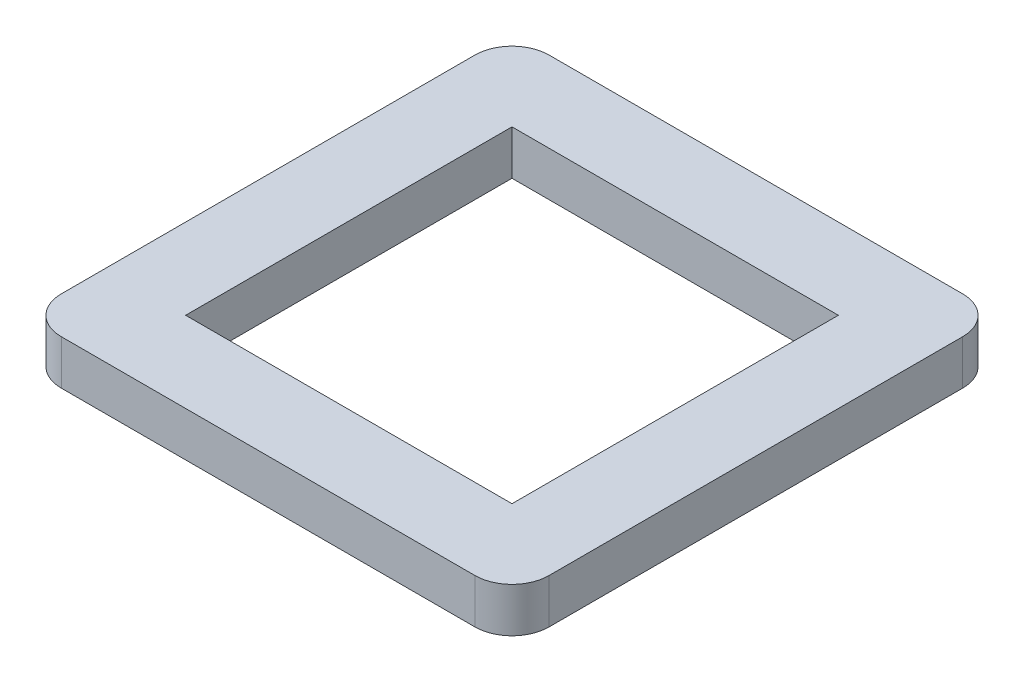
ISO-10303-21;
HEADER;
FILE_DESCRIPTION(('STEP AP214'),'2;1');
FILE_NAME('part.step','',(''),(''),'','','');
FILE_SCHEMA(('AUTOMOTIVE_DESIGN { 1 0 10303 214 1 1 1 1 }'));
ENDSEC;
DATA;
#1=APPLICATION_CONTEXT('core data for automotive mechanical design processes');
#2=APPLICATION_PROTOCOL_DEFINITION('international standard','automotive_design',2000,#1);
#3=PRODUCT_CONTEXT('',#1,'mechanical');
#4=PRODUCT('Part','Part','',(#3));
#5=PRODUCT_RELATED_PRODUCT_CATEGORY('part','',(#4));
#6=PRODUCT_DEFINITION_FORMATION('','',#4);
#7=PRODUCT_DEFINITION_CONTEXT('part definition',#1,'design');
#8=PRODUCT_DEFINITION('design','',#6,#7);
#9=PRODUCT_DEFINITION_SHAPE('','',#8);
#10=(LENGTH_UNIT() NAMED_UNIT(*) SI_UNIT(.MILLI.,.METRE.));
#11=(NAMED_UNIT(*) PLANE_ANGLE_UNIT() SI_UNIT($,.RADIAN.));
#12=(NAMED_UNIT(*) SI_UNIT($,.STERADIAN.) SOLID_ANGLE_UNIT());
#13=UNCERTAINTY_MEASURE_WITH_UNIT(LENGTH_MEASURE(1.E-05),#10,'distance_accuracy_value','');
#14=(GEOMETRIC_REPRESENTATION_CONTEXT(3) GLOBAL_UNCERTAINTY_ASSIGNED_CONTEXT((#13)) GLOBAL_UNIT_ASSIGNED_CONTEXT((#10,
#11,#12)) REPRESENTATION_CONTEXT('',''));
#15=CARTESIAN_POINT('',(0.,0.,0.));
#16=DIRECTION('',(0.,0.,1.));
#17=DIRECTION('',(1.,0.,0.));
#18=AXIS2_PLACEMENT_3D('',#15,#16,#17);
#19=CARTESIAN_POINT('',(69.5,6.35,69.5));
#20=DIRECTION('',(-1.,0.,0.));
#21=DIRECTION('',(0.,0.,1.));
#22=AXIS2_PLACEMENT_3D('',#19,#20,#21);
#23=PLANE('',#22);
#24=DIRECTION('',(0.,0.,-1.));
#25=VECTOR('',#24,1.);
#26=CARTESIAN_POINT('',(69.5,6.35,69.5));
#27=LINE('',#26,#25);
#28=CARTESIAN_POINT('',(69.5,6.35,58.94));
#29=VERTEX_POINT('',#28);
#30=CARTESIAN_POINT('',(69.5,6.35,-58.94));
#31=VERTEX_POINT('',#30);
#32=EDGE_CURVE('E159',#29,#31,#27,.T.);
#33=ORIENTED_EDGE('',*,*,#32,.F.);
#34=DIRECTION('',(0.,-1.,0.));
#35=VECTOR('',#34,1.);
#36=CARTESIAN_POINT('',(69.5,6.35,58.94));
#37=LINE('',#36,#35);
#38=CARTESIAN_POINT('',(69.5,-6.35,58.94));
#39=VERTEX_POINT('',#38);
#40=EDGE_CURVE('E184',#29,#39,#37,.T.);
#41=ORIENTED_EDGE('',*,*,#40,.T.);
#42=DIRECTION('',(0.,0.,-1.));
#43=VECTOR('',#42,1.);
#44=CARTESIAN_POINT('',(69.5,-6.35,69.5));
#45=LINE('',#44,#43);
#46=CARTESIAN_POINT('',(69.5,-6.35,-58.94));
#47=VERTEX_POINT('',#46);
#48=EDGE_CURVE('E155',#39,#47,#45,.T.);
#49=ORIENTED_EDGE('',*,*,#48,.T.);
#50=DIRECTION('',(0.,-1.,0.));
#51=VECTOR('',#50,1.);
#52=CARTESIAN_POINT('',(69.5,6.35,-58.94));
#53=LINE('',#52,#51);
#54=EDGE_CURVE('E172',#47,#31,#53,.F.);
#55=ORIENTED_EDGE('',*,*,#54,.T.);
#56=EDGE_LOOP('',(#33,#41,#49,#55));
#57=FACE_BOUND('',#56,.T.);
#58=ADVANCED_FACE('F33',(#57),#23,.F.);
#59=CARTESIAN_POINT('',(-69.5,6.35,-69.5));
#60=DIRECTION('',(0.,0.,1.));
#61=DIRECTION('',(1.,0.,0.));
#62=AXIS2_PLACEMENT_3D('',#59,#60,#61);
#63=PLANE('',#62);
#64=DIRECTION('',(-1.,0.,0.));
#65=VECTOR('',#64,1.);
#66=CARTESIAN_POINT('',(-69.5,6.35,-69.5));
#67=LINE('',#66,#65);
#68=CARTESIAN_POINT('',(58.9399999999999,6.35,-69.5));
#69=VERTEX_POINT('',#68);
#70=CARTESIAN_POINT('',(-58.94,6.35,-69.5));
#71=VERTEX_POINT('',#70);
#72=EDGE_CURVE('E162',#69,#71,#67,.T.);
#73=ORIENTED_EDGE('',*,*,#72,.F.);
#74=DIRECTION('',(0.,-1.,0.));
#75=VECTOR('',#74,1.);
#76=CARTESIAN_POINT('',(58.9399999999999,6.35,-69.5));
#77=LINE('',#76,#75);
#78=CARTESIAN_POINT('',(58.9399999999999,-6.35,-69.5));
#79=VERTEX_POINT('',#78);
#80=EDGE_CURVE('E210',#69,#79,#77,.T.);
#81=ORIENTED_EDGE('',*,*,#80,.T.);
#82=DIRECTION('',(-1.,0.,0.));
#83=VECTOR('',#82,1.);
#84=CARTESIAN_POINT('',(-69.5,-6.35,-69.5));
#85=LINE('',#84,#83);
#86=CARTESIAN_POINT('',(-58.94,-6.35,-69.5));
#87=VERTEX_POINT('',#86);
#88=EDGE_CURVE('E175',#79,#87,#85,.T.);
#89=ORIENTED_EDGE('',*,*,#88,.T.);
#90=DIRECTION('',(0.,-1.,0.));
#91=VECTOR('',#90,1.);
#92=CARTESIAN_POINT('',(-58.94,6.35,-69.5));
#93=LINE('',#92,#91);
#94=EDGE_CURVE('E208',#87,#71,#93,.F.);
#95=ORIENTED_EDGE('',*,*,#94,.T.);
#96=EDGE_LOOP('',(#73,#81,#89,#95));
#97=FACE_BOUND('',#96,.T.);
#98=ADVANCED_FACE('F244',(#97),#63,.F.);
#99=CARTESIAN_POINT('',(-69.5,6.35,69.5));
#100=DIRECTION('',(1.,0.,0.));
#101=DIRECTION('',(0.,0.,-1.));
#102=AXIS2_PLACEMENT_3D('',#99,#100,#101);
#103=PLANE('',#102);
#104=DIRECTION('',(0.,0.,1.));
#105=VECTOR('',#104,1.);
#106=CARTESIAN_POINT('',(-69.5,6.35,69.5));
#107=LINE('',#106,#105);
#108=CARTESIAN_POINT('',(-69.5,6.35,-58.9399999999999));
#109=VERTEX_POINT('',#108);
#110=CARTESIAN_POINT('',(-69.5,6.35,58.94));
#111=VERTEX_POINT('',#110);
#112=EDGE_CURVE('E166',#109,#111,#107,.T.);
#113=ORIENTED_EDGE('',*,*,#112,.F.);
#114=DIRECTION('',(0.,-1.,0.));
#115=VECTOR('',#114,1.);
#116=CARTESIAN_POINT('',(-69.5,6.35,-58.9399999999999));
#117=LINE('',#116,#115);
#118=CARTESIAN_POINT('',(-69.5,-6.35,-58.9399999999999));
#119=VERTEX_POINT('',#118);
#120=EDGE_CURVE('E11',#109,#119,#117,.T.);
#121=ORIENTED_EDGE('',*,*,#120,.T.);
#122=DIRECTION('',(0.,0.,1.));
#123=VECTOR('',#122,1.);
#124=CARTESIAN_POINT('',(-69.5,-6.35,69.5));
#125=LINE('',#124,#123);
#126=CARTESIAN_POINT('',(-69.5,-6.35,58.94));
#127=VERTEX_POINT('',#126);
#128=EDGE_CURVE('E178',#119,#127,#125,.T.);
#129=ORIENTED_EDGE('',*,*,#128,.T.);
#130=DIRECTION('',(0.,-1.,0.));
#131=VECTOR('',#130,1.);
#132=CARTESIAN_POINT('',(-69.5,6.35,58.94));
#133=LINE('',#132,#131);
#134=EDGE_CURVE('E41',#127,#111,#133,.F.);
#135=ORIENTED_EDGE('',*,*,#134,.T.);
#136=EDGE_LOOP('',(#113,#121,#129,#135));
#137=FACE_BOUND('',#136,.T.);
#138=ADVANCED_FACE('F215',(#137),#103,.F.);
#139=CARTESIAN_POINT('',(-69.5,6.35,69.5));
#140=DIRECTION('',(0.,0.,-1.));
#141=DIRECTION('',(-1.,0.,0.));
#142=AXIS2_PLACEMENT_3D('',#139,#140,#141);
#143=PLANE('',#142);
#144=DIRECTION('',(1.,0.,0.));
#145=VECTOR('',#144,1.);
#146=CARTESIAN_POINT('',(-69.5,-6.35,69.5));
#147=LINE('',#146,#145);
#148=CARTESIAN_POINT('',(-58.94,-6.35,69.5));
#149=VERTEX_POINT('',#148);
#150=CARTESIAN_POINT('',(58.94,-6.35,69.5));
#151=VERTEX_POINT('',#150);
#152=EDGE_CURVE('E163',#149,#151,#147,.T.);
#153=ORIENTED_EDGE('',*,*,#152,.T.);
#154=DIRECTION('',(0.,-1.,0.));
#155=VECTOR('',#154,1.);
#156=CARTESIAN_POINT('',(58.94,6.35,69.5));
#157=LINE('',#156,#155);
#158=CARTESIAN_POINT('',(58.94,6.35,69.5));
#159=VERTEX_POINT('',#158);
#160=EDGE_CURVE('E198',#151,#159,#157,.F.);
#161=ORIENTED_EDGE('',*,*,#160,.T.);
#162=DIRECTION('',(1.,0.,0.));
#163=VECTOR('',#162,1.);
#164=CARTESIAN_POINT('',(-69.5,6.35,69.5));
#165=LINE('',#164,#163);
#166=CARTESIAN_POINT('',(-58.94,6.35,69.5));
#167=VERTEX_POINT('',#166);
#168=EDGE_CURVE('E169',#167,#159,#165,.T.);
#169=ORIENTED_EDGE('',*,*,#168,.F.);
#170=DIRECTION('',(0.,-1.,0.));
#171=VECTOR('',#170,1.);
#172=CARTESIAN_POINT('',(-58.94,6.35,69.5));
#173=LINE('',#172,#171);
#174=EDGE_CURVE('E195',#167,#149,#173,.T.);
#175=ORIENTED_EDGE('',*,*,#174,.T.);
#176=EDGE_LOOP('',(#153,#161,#169,#175));
#177=FACE_BOUND('',#176,.T.);
#178=ADVANCED_FACE('F227',(#177),#143,.F.);
#179=CARTESIAN_POINT('',(0.,6.35,0.));
#180=DIRECTION('',(0.,-1.,0.));
#181=DIRECTION('',(0.,0.,-1.));
#182=AXIS2_PLACEMENT_3D('',#179,#180,#181);
#183=PLANE('',#182);
#184=DIRECTION('',(-1.,0.,0.));
#185=VECTOR('',#184,1.);
#186=CARTESIAN_POINT('',(-46.5,6.35,-46.5));
#187=LINE('',#186,#185);
#188=CARTESIAN_POINT('',(46.5,6.35,-46.5));
#189=VERTEX_POINT('',#188);
#190=CARTESIAN_POINT('',(-46.5,6.35,-46.5));
#191=VERTEX_POINT('',#190);
#192=EDGE_CURVE('E149',#189,#191,#187,.T.);
#193=ORIENTED_EDGE('',*,*,#192,.F.);
#194=DIRECTION('',(0.,0.,-1.));
#195=VECTOR('',#194,1.);
#196=CARTESIAN_POINT('',(46.5,6.35,46.5));
#197=LINE('',#196,#195);
#198=CARTESIAN_POINT('',(46.5,6.35,46.5));
#199=VERTEX_POINT('',#198);
#200=EDGE_CURVE('E48',#199,#189,#197,.T.);
#201=ORIENTED_EDGE('',*,*,#200,.F.);
#202=DIRECTION('',(1.,0.,0.));
#203=VECTOR('',#202,1.);
#204=CARTESIAN_POINT('',(-46.5,6.35,46.5));
#205=LINE('',#204,#203);
#206=CARTESIAN_POINT('',(-46.5,6.35,46.5));
#207=VERTEX_POINT('',#206);
#208=EDGE_CURVE('E140',#207,#199,#205,.T.);
#209=ORIENTED_EDGE('',*,*,#208,.F.);
#210=DIRECTION('',(0.,0.,1.));
#211=VECTOR('',#210,1.);
#212=CARTESIAN_POINT('',(-46.5,6.35,46.5));
#213=LINE('',#212,#211);
#214=EDGE_CURVE('E143',#191,#207,#213,.T.);
#215=ORIENTED_EDGE('',*,*,#214,.F.);
#216=EDGE_LOOP('',(#193,#201,#209,#215));
#217=FACE_BOUND('',#216,.T.);
#218=ORIENTED_EDGE('',*,*,#168,.T.);
#219=CARTESIAN_POINT('',(58.94,6.35,58.94));
#220=DIRECTION('',(0.,-1.,0.));
#221=DIRECTION('',(0.,0.,-1.));
#222=AXIS2_PLACEMENT_3D('',#219,#220,#221);
#223=CIRCLE('',#222,10.56);
#224=EDGE_CURVE('E206',#159,#29,#223,.F.);
#225=ORIENTED_EDGE('',*,*,#224,.T.);
#226=ORIENTED_EDGE('',*,*,#32,.T.);
#227=CARTESIAN_POINT('',(58.9399999999999,6.35,-58.94));
#228=DIRECTION('',(0.,-1.,0.));
#229=DIRECTION('',(0.,0.,-1.));
#230=AXIS2_PLACEMENT_3D('',#227,#228,#229);
#231=CIRCLE('',#230,10.56);
#232=EDGE_CURVE('E204',#31,#69,#231,.F.);
#233=ORIENTED_EDGE('',*,*,#232,.T.);
#234=ORIENTED_EDGE('',*,*,#72,.T.);
#235=CARTESIAN_POINT('',(-58.94,6.35,-58.9399999999999));
#236=DIRECTION('',(0.,-1.,0.));
#237=DIRECTION('',(0.,0.,-1.));
#238=AXIS2_PLACEMENT_3D('',#235,#236,#237);
#239=CIRCLE('',#238,10.56);
#240=EDGE_CURVE('E202',#71,#109,#239,.F.);
#241=ORIENTED_EDGE('',*,*,#240,.T.);
#242=ORIENTED_EDGE('',*,*,#112,.T.);
#243=CARTESIAN_POINT('',(-58.94,6.35,58.94));
#244=DIRECTION('',(0.,-1.,0.));
#245=DIRECTION('',(0.,0.,-1.));
#246=AXIS2_PLACEMENT_3D('',#243,#244,#245);
#247=CIRCLE('',#246,10.56);
#248=EDGE_CURVE('E200',#111,#167,#247,.F.);
#249=ORIENTED_EDGE('',*,*,#248,.T.);
#250=EDGE_LOOP('',(#218,#225,#226,#233,#234,#241,#242,#249));
#251=FACE_BOUND('',#250,.T.);
#252=ADVANCED_FACE('F221',(#217,#251),#183,.F.);
#253=CARTESIAN_POINT('',(0.,-6.35,0.));
#254=DIRECTION('',(0.,-1.,0.));
#255=DIRECTION('',(0.,0.,-1.));
#256=AXIS2_PLACEMENT_3D('',#253,#254,#255);
#257=PLANE('',#256);
#258=DIRECTION('',(0.,0.,-1.));
#259=VECTOR('',#258,1.);
#260=CARTESIAN_POINT('',(46.5,-6.35,46.5));
#261=LINE('',#260,#259);
#262=CARTESIAN_POINT('',(46.5,-6.35,46.5));
#263=VERTEX_POINT('',#262);
#264=CARTESIAN_POINT('',(46.5,-6.35,-46.5));
#265=VERTEX_POINT('',#264);
#266=EDGE_CURVE('E124',#263,#265,#261,.T.);
#267=ORIENTED_EDGE('',*,*,#266,.T.);
#268=DIRECTION('',(-1.,0.,0.));
#269=VECTOR('',#268,1.);
#270=CARTESIAN_POINT('',(-46.5,-6.35,-46.5));
#271=LINE('',#270,#269);
#272=CARTESIAN_POINT('',(-46.5,-6.35,-46.5));
#273=VERTEX_POINT('',#272);
#274=EDGE_CURVE('E133',#265,#273,#271,.T.);
#275=ORIENTED_EDGE('',*,*,#274,.T.);
#276=DIRECTION('',(0.,0.,1.));
#277=VECTOR('',#276,1.);
#278=CARTESIAN_POINT('',(-46.5,-6.35,46.5));
#279=LINE('',#278,#277);
#280=CARTESIAN_POINT('',(-46.5,-6.35,46.5));
#281=VERTEX_POINT('',#280);
#282=EDGE_CURVE('E56',#273,#281,#279,.T.);
#283=ORIENTED_EDGE('',*,*,#282,.T.);
#284=DIRECTION('',(1.,0.,0.));
#285=VECTOR('',#284,1.);
#286=CARTESIAN_POINT('',(-46.5,-6.35,46.5));
#287=LINE('',#286,#285);
#288=EDGE_CURVE('E130',#281,#263,#287,.T.);
#289=ORIENTED_EDGE('',*,*,#288,.T.);
#290=EDGE_LOOP('',(#267,#275,#283,#289));
#291=FACE_BOUND('',#290,.T.);
#292=ORIENTED_EDGE('',*,*,#48,.F.);
#293=CARTESIAN_POINT('',(58.94,-6.35,58.94));
#294=DIRECTION('',(0.,-1.,0.));
#295=DIRECTION('',(0.,0.,-1.));
#296=AXIS2_PLACEMENT_3D('',#293,#294,#295);
#297=CIRCLE('',#296,10.56);
#298=EDGE_CURVE('E193',#39,#151,#297,.T.);
#299=ORIENTED_EDGE('',*,*,#298,.T.);
#300=ORIENTED_EDGE('',*,*,#152,.F.);
#301=CARTESIAN_POINT('',(-58.94,-6.35,58.94));
#302=DIRECTION('',(0.,-1.,0.));
#303=DIRECTION('',(0.,0.,-1.));
#304=AXIS2_PLACEMENT_3D('',#301,#302,#303);
#305=CIRCLE('',#304,10.56);
#306=EDGE_CURVE('E187',#149,#127,#305,.T.);
#307=ORIENTED_EDGE('',*,*,#306,.T.);
#308=ORIENTED_EDGE('',*,*,#128,.F.);
#309=CARTESIAN_POINT('',(-58.94,-6.35,-58.9399999999999));
#310=DIRECTION('',(0.,-1.,0.));
#311=DIRECTION('',(0.,0.,-1.));
#312=AXIS2_PLACEMENT_3D('',#309,#310,#311);
#313=CIRCLE('',#312,10.56);
#314=EDGE_CURVE('E189',#119,#87,#313,.T.);
#315=ORIENTED_EDGE('',*,*,#314,.T.);
#316=ORIENTED_EDGE('',*,*,#88,.F.);
#317=CARTESIAN_POINT('',(58.9399999999999,-6.35,-58.94));
#318=DIRECTION('',(0.,-1.,0.));
#319=DIRECTION('',(0.,0.,-1.));
#320=AXIS2_PLACEMENT_3D('',#317,#318,#319);
#321=CIRCLE('',#320,10.56);
#322=EDGE_CURVE('E191',#79,#47,#321,.T.);
#323=ORIENTED_EDGE('',*,*,#322,.T.);
#324=EDGE_LOOP('',(#292,#299,#300,#307,#308,#315,#316,#323));
#325=FACE_BOUND('',#324,.T.);
#326=ADVANCED_FACE('F137',(#291,#325),#257,.T.);
#327=CARTESIAN_POINT('',(58.94,6.35,58.94));
#328=DIRECTION('',(0.,-1.,0.));
#329=DIRECTION('',(0.,0.,-1.));
#330=AXIS2_PLACEMENT_3D('',#327,#328,#329);
#331=CYLINDRICAL_SURFACE('',#330,10.56);
#332=ORIENTED_EDGE('',*,*,#224,.F.);
#333=ORIENTED_EDGE('',*,*,#160,.F.);
#334=ORIENTED_EDGE('',*,*,#298,.F.);
#335=ORIENTED_EDGE('',*,*,#40,.F.);
#336=EDGE_LOOP('',(#332,#333,#334,#335));
#337=FACE_BOUND('',#336,.T.);
#338=ADVANCED_FACE('F233',(#337),#331,.T.);
#339=CARTESIAN_POINT('',(58.9399999999999,6.35,-58.94));
#340=DIRECTION('',(0.,-1.,0.));
#341=DIRECTION('',(0.,0.,-1.));
#342=AXIS2_PLACEMENT_3D('',#339,#340,#341);
#343=CYLINDRICAL_SURFACE('',#342,10.56);
#344=ORIENTED_EDGE('',*,*,#232,.F.);
#345=ORIENTED_EDGE('',*,*,#54,.F.);
#346=ORIENTED_EDGE('',*,*,#322,.F.);
#347=ORIENTED_EDGE('',*,*,#80,.F.);
#348=EDGE_LOOP('',(#344,#345,#346,#347));
#349=FACE_BOUND('',#348,.T.);
#350=ADVANCED_FACE('F241',(#349),#343,.T.);
#351=CARTESIAN_POINT('',(-58.94,6.35,-58.9399999999999));
#352=DIRECTION('',(0.,-1.,0.));
#353=DIRECTION('',(0.,0.,-1.));
#354=AXIS2_PLACEMENT_3D('',#351,#352,#353);
#355=CYLINDRICAL_SURFACE('',#354,10.56);
#356=ORIENTED_EDGE('',*,*,#240,.F.);
#357=ORIENTED_EDGE('',*,*,#94,.F.);
#358=ORIENTED_EDGE('',*,*,#314,.F.);
#359=ORIENTED_EDGE('',*,*,#120,.F.);
#360=EDGE_LOOP('',(#356,#357,#358,#359));
#361=FACE_BOUND('',#360,.T.);
#362=ADVANCED_FACE('F247',(#361),#355,.T.);
#363=CARTESIAN_POINT('',(-58.94,6.35,58.94));
#364=DIRECTION('',(0.,-1.,0.));
#365=DIRECTION('',(0.,0.,-1.));
#366=AXIS2_PLACEMENT_3D('',#363,#364,#365);
#367=CYLINDRICAL_SURFACE('',#366,10.56);
#368=ORIENTED_EDGE('',*,*,#248,.F.);
#369=ORIENTED_EDGE('',*,*,#134,.F.);
#370=ORIENTED_EDGE('',*,*,#306,.F.);
#371=ORIENTED_EDGE('',*,*,#174,.F.);
#372=EDGE_LOOP('',(#368,#369,#370,#371));
#373=FACE_BOUND('',#372,.T.);
#374=ADVANCED_FACE('F35',(#373),#367,.T.);
#375=CARTESIAN_POINT('',(46.5,-6.35,46.5));
#376=DIRECTION('',(1.,0.,0.));
#377=DIRECTION('',(0.,0.,-1.));
#378=AXIS2_PLACEMENT_3D('',#375,#376,#377);
#379=PLANE('',#378);
#380=ORIENTED_EDGE('',*,*,#200,.T.);
#381=DIRECTION('',(0.,1.,0.));
#382=VECTOR('',#381,1.);
#383=CARTESIAN_POINT('',(46.5,-6.35,-46.5));
#384=LINE('',#383,#382);
#385=EDGE_CURVE('E120',#265,#189,#384,.T.);
#386=ORIENTED_EDGE('',*,*,#385,.F.);
#387=ORIENTED_EDGE('',*,*,#266,.F.);
#388=DIRECTION('',(0.,1.,0.));
#389=VECTOR('',#388,1.);
#390=CARTESIAN_POINT('',(46.5,-6.35,46.5));
#391=LINE('',#390,#389);
#392=EDGE_CURVE('E153',#263,#199,#391,.T.);
#393=ORIENTED_EDGE('',*,*,#392,.T.);
#394=EDGE_LOOP('',(#380,#386,#387,#393));
#395=FACE_BOUND('',#394,.T.);
#396=ADVANCED_FACE('F122',(#395),#379,.F.);
#397=CARTESIAN_POINT('',(-46.5,-6.35,46.5));
#398=DIRECTION('',(0.,0.,1.));
#399=DIRECTION('',(1.,0.,0.));
#400=AXIS2_PLACEMENT_3D('',#397,#398,#399);
#401=PLANE('',#400);
#402=ORIENTED_EDGE('',*,*,#208,.T.);
#403=ORIENTED_EDGE('',*,*,#392,.F.);
#404=ORIENTED_EDGE('',*,*,#288,.F.);
#405=DIRECTION('',(0.,1.,0.));
#406=VECTOR('',#405,1.);
#407=CARTESIAN_POINT('',(-46.5,-6.35,46.5));
#408=LINE('',#407,#406);
#409=EDGE_CURVE('E156',#281,#207,#408,.T.);
#410=ORIENTED_EDGE('',*,*,#409,.T.);
#411=EDGE_LOOP('',(#402,#403,#404,#410));
#412=FACE_BOUND('',#411,.T.);
#413=ADVANCED_FACE('F305',(#412),#401,.F.);
#414=CARTESIAN_POINT('',(-46.5,-6.35,46.5));
#415=DIRECTION('',(-1.,0.,0.));
#416=DIRECTION('',(0.,0.,1.));
#417=AXIS2_PLACEMENT_3D('',#414,#415,#416);
#418=PLANE('',#417);
#419=ORIENTED_EDGE('',*,*,#214,.T.);
#420=ORIENTED_EDGE('',*,*,#409,.F.);
#421=ORIENTED_EDGE('',*,*,#282,.F.);
#422=DIRECTION('',(0.,1.,0.));
#423=VECTOR('',#422,1.);
#424=CARTESIAN_POINT('',(-46.5,-6.35,-46.5));
#425=LINE('',#424,#423);
#426=EDGE_CURVE('E129',#273,#191,#425,.T.);
#427=ORIENTED_EDGE('',*,*,#426,.T.);
#428=EDGE_LOOP('',(#419,#420,#421,#427));
#429=FACE_BOUND('',#428,.T.);
#430=ADVANCED_FACE('F313',(#429),#418,.F.);
#431=CARTESIAN_POINT('',(-46.5,-6.35,-46.5));
#432=DIRECTION('',(0.,0.,-1.));
#433=DIRECTION('',(-1.,0.,0.));
#434=AXIS2_PLACEMENT_3D('',#431,#432,#433);
#435=PLANE('',#434);
#436=ORIENTED_EDGE('',*,*,#192,.T.);
#437=ORIENTED_EDGE('',*,*,#426,.F.);
#438=ORIENTED_EDGE('',*,*,#274,.F.);
#439=ORIENTED_EDGE('',*,*,#385,.T.);
#440=EDGE_LOOP('',(#436,#437,#438,#439));
#441=FACE_BOUND('',#440,.T.);
#442=ADVANCED_FACE('F134',(#441),#435,.F.);
#443=CLOSED_SHELL('',(#58,#98,#138,#178,#252,#326,#338,#350,#362,#374,#396,#413,#430,#442));
#444=MANIFOLD_SOLID_BREP('B2',#443);
#445=ADVANCED_BREP_SHAPE_REPRESENTATION('',(#18,#444),#14);
#446=SHAPE_DEFINITION_REPRESENTATION(#9,#445);
ENDSEC;
END-ISO-10303-21;
